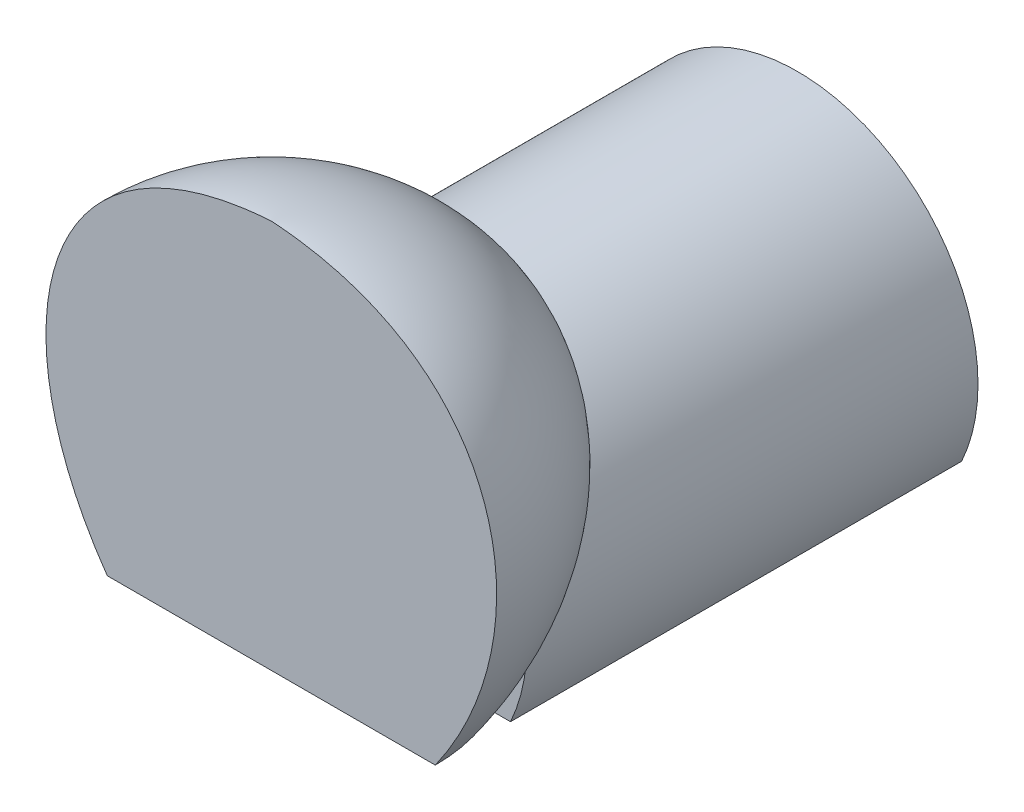
ISO-10303-21;
HEADER;
FILE_DESCRIPTION(('STEP AP214'),'2;1');
FILE_NAME('part.step','',(''),(''),'','','');
FILE_SCHEMA(('AUTOMOTIVE_DESIGN { 1 0 10303 214 1 1 1 1 }'));
ENDSEC;
DATA;
#1=APPLICATION_CONTEXT('core data for automotive mechanical design processes');
#2=APPLICATION_PROTOCOL_DEFINITION('international standard','automotive_design',2000,#1);
#3=PRODUCT_CONTEXT('',#1,'mechanical');
#4=PRODUCT('Part','Part','',(#3));
#5=PRODUCT_RELATED_PRODUCT_CATEGORY('part','',(#4));
#6=PRODUCT_DEFINITION_FORMATION('','',#4);
#7=PRODUCT_DEFINITION_CONTEXT('part definition',#1,'design');
#8=PRODUCT_DEFINITION('design','',#6,#7);
#9=PRODUCT_DEFINITION_SHAPE('','',#8);
#10=(LENGTH_UNIT() NAMED_UNIT(*) SI_UNIT(.MILLI.,.METRE.));
#11=(NAMED_UNIT(*) PLANE_ANGLE_UNIT() SI_UNIT($,.RADIAN.));
#12=(NAMED_UNIT(*) SI_UNIT($,.STERADIAN.) SOLID_ANGLE_UNIT());
#13=UNCERTAINTY_MEASURE_WITH_UNIT(LENGTH_MEASURE(1.E-05),#10,'distance_accuracy_value','');
#14=(GEOMETRIC_REPRESENTATION_CONTEXT(3) GLOBAL_UNCERTAINTY_ASSIGNED_CONTEXT((#13)) GLOBAL_UNIT_ASSIGNED_CONTEXT((#10,
#11,#12)) REPRESENTATION_CONTEXT('',''));
#15=CARTESIAN_POINT('',(0.,0.,0.));
#16=DIRECTION('',(0.,0.,1.));
#17=DIRECTION('',(1.,0.,0.));
#18=AXIS2_PLACEMENT_3D('',#15,#16,#17);
#19=CARTESIAN_POINT('',(10.9087121146357,0.,35.));
#20=DIRECTION('',(0.,-1.,0.));
#21=DIRECTION('',(0.,0.,-1.));
#22=AXIS2_PLACEMENT_3D('',#19,#20,#21);
#23=PLANE('',#22);
#24=CARTESIAN_POINT('',(10.9087121146357,0.,35.));
#25=DIRECTION('',(0.,-1.,0.));
#26=DIRECTION('',(0.,0.,-1.));
#27=AXIS2_PLACEMENT_3D('',#24,#25,#26);
#28=CIRCLE('',#27,10.9087121146357);
#29=CARTESIAN_POINT('',(0.,0.,35.0000000000001));
#30=VERTEX_POINT('',#29);
#31=CARTESIAN_POINT('',(21.8174242292714,0.,35.));
#32=VERTEX_POINT('',#31);
#33=EDGE_CURVE('E12',#30,#32,#28,.T.);
#34=ORIENTED_EDGE('',*,*,#33,.T.);
#35=DIRECTION('',(-1.,0.,0.));
#36=VECTOR('',#35,1.);
#37=CARTESIAN_POINT('',(10.9087121146357,0.,35.));
#38=LINE('',#37,#36);
#39=EDGE_CURVE('E65',#32,#30,#38,.T.);
#40=ORIENTED_EDGE('',*,*,#39,.T.);
#41=EDGE_LOOP('',(#34,#40));
#42=FACE_BOUND('',#41,.T.);
#43=ADVANCED_FACE('F43',(#42),#23,.T.);
#44=CARTESIAN_POINT('',(0.,0.,35.0000000000001));
#45=CARTESIAN_POINT('',(-7.69935288561253,10.9150571942187,35.0000000000001));
#46=CARTESIAN_POINT('',(-4.72379979597356,24.8623555992467,35.0000000000001));
#47=CARTESIAN_POINT('',(10.9087121146357,25.8843814165601,35.));
#48=B_SPLINE_CURVE_WITH_KNOTS('',3,(#44,#45,#46,#47),.UNSPECIFIED.,.F.,.F.,(4,4),(0.,1.),.UNSPECIFIED.);
#49=CARTESIAN_POINT('',(10.9087121146357,0.,35.));
#50=DIRECTION('',(0.,-1.,0.));
#51=AXIS1_PLACEMENT('',#49,#50);
#52=SURFACE_OF_REVOLUTION('',#48,#51);
#53=CARTESIAN_POINT('',(21.8174242292714,0.,35.));
#54=CARTESIAN_POINT('',(29.516777114884,10.9150571942187,35.));
#55=CARTESIAN_POINT('',(26.541224025245,24.8623555992467,35.));
#56=CARTESIAN_POINT('',(10.9087121146357,25.8843814165601,35.));
#57=B_SPLINE_CURVE_WITH_KNOTS('',3,(#53,#54,#55,#56),.UNSPECIFIED.,.F.,.F.,(4,4),(0.,1.),.UNSPECIFIED.);
#58=CARTESIAN_POINT('',(10.9087121146357,25.8843814165601,35.));
#59=VERTEX_POINT('',#58);
#60=EDGE_CURVE('E58',#32,#59,#57,.T.);
#61=ORIENTED_EDGE('',*,*,#60,.F.);
#62=ORIENTED_EDGE('',*,*,#33,.F.);
#63=EDGE_CURVE('E51',#30,#59,#48,.T.);
#64=ORIENTED_EDGE('',*,*,#63,.T.);
#65=EDGE_LOOP('',(#61,#62,#64));
#66=FACE_BOUND('',#65,.T.);
#67=ADVANCED_FACE('F45',(#66),#52,.F.);
#68=CARTESIAN_POINT('',(-3.29509324126532,16.6520774746195,35.0000000000001));
#69=DIRECTION('',(0.,0.,-1.));
#70=DIRECTION('',(-1.,0.,0.));
#71=AXIS2_PLACEMENT_3D('',#68,#69,#70);
#72=PLANE('',#71);
#73=ORIENTED_EDGE('',*,*,#39,.F.);
#74=ORIENTED_EDGE('',*,*,#60,.T.);
#75=ORIENTED_EDGE('',*,*,#63,.F.);
#76=EDGE_LOOP('',(#73,#74,#75));
#77=FACE_BOUND('',#76,.T.);
#78=ADVANCED_FACE('F66',(#77),#72,.F.);
#79=CLOSED_SHELL('',(#43,#67,#78));
#80=MANIFOLD_SOLID_BREP('B2',#79);
#81=CARTESIAN_POINT('',(10.9087121146357,5.,30.));
#82=DIRECTION('',(0.,0.,-1.));
#83=DIRECTION('',(-1.,0.,0.));
#84=AXIS2_PLACEMENT_3D('',#81,#82,#83);
#85=CYLINDRICAL_SURFACE('',#84,12.);
#86=CARTESIAN_POINT('',(10.9087121146357,5.,0.));
#87=DIRECTION('',(0.,0.,1.));
#88=DIRECTION('',(-1.,0.,0.));
#89=AXIS2_PLACEMENT_3D('',#86,#87,#88);
#90=CIRCLE('',#89,12.);
#91=CARTESIAN_POINT('',(21.8174242292714,0.,0.));
#92=VERTEX_POINT('',#91);
#93=CARTESIAN_POINT('',(0.,0.,0.));
#94=VERTEX_POINT('',#93);
#95=EDGE_CURVE('E140',#92,#94,#90,.T.);
#96=ORIENTED_EDGE('',*,*,#95,.T.);
#97=DIRECTION('',(0.,0.,-1.));
#98=VECTOR('',#97,1.);
#99=CARTESIAN_POINT('',(0.,0.,30.));
#100=LINE('',#99,#98);
#101=CARTESIAN_POINT('',(0.,0.,30.));
#102=VERTEX_POINT('',#101);
#103=EDGE_CURVE('E41',#102,#94,#100,.T.);
#104=ORIENTED_EDGE('',*,*,#103,.F.);
#105=CARTESIAN_POINT('',(10.9087121146357,5.,30.));
#106=DIRECTION('',(0.,0.,1.));
#107=DIRECTION('',(-1.,0.,0.));
#108=AXIS2_PLACEMENT_3D('',#105,#106,#107);
#109=CIRCLE('',#108,12.);
#110=CARTESIAN_POINT('',(21.8174242292714,0.,30.));
#111=VERTEX_POINT('',#110);
#112=EDGE_CURVE('E139',#111,#102,#109,.T.);
#113=ORIENTED_EDGE('',*,*,#112,.F.);
#114=DIRECTION('',(0.,0.,-1.));
#115=VECTOR('',#114,1.);
#116=CARTESIAN_POINT('',(21.8174242292714,0.,30.));
#117=LINE('',#116,#115);
#118=EDGE_CURVE('E117',#111,#92,#117,.T.);
#119=ORIENTED_EDGE('',*,*,#118,.T.);
#120=EDGE_LOOP('',(#96,#104,#113,#119));
#121=FACE_BOUND('',#120,.T.);
#122=ADVANCED_FACE('F109',(#121),#85,.T.);
#123=CARTESIAN_POINT('',(0.,0.,30.));
#124=DIRECTION('',(0.,1.,0.));
#125=DIRECTION('',(0.,0.,1.));
#126=AXIS2_PLACEMENT_3D('',#123,#124,#125);
#127=PLANE('',#126);
#128=DIRECTION('',(1.,0.,0.));
#129=VECTOR('',#128,1.);
#130=CARTESIAN_POINT('',(0.,0.,0.));
#131=LINE('',#130,#129);
#132=EDGE_CURVE('E132',#94,#92,#131,.T.);
#133=ORIENTED_EDGE('',*,*,#132,.T.);
#134=ORIENTED_EDGE('',*,*,#118,.F.);
#135=DIRECTION('',(1.,0.,0.));
#136=VECTOR('',#135,1.);
#137=CARTESIAN_POINT('',(0.,0.,30.));
#138=LINE('',#137,#136);
#139=EDGE_CURVE('E124',#102,#111,#138,.T.);
#140=ORIENTED_EDGE('',*,*,#139,.F.);
#141=ORIENTED_EDGE('',*,*,#103,.T.);
#142=EDGE_LOOP('',(#133,#134,#140,#141));
#143=FACE_BOUND('',#142,.T.);
#144=ADVANCED_FACE('F135',(#143),#127,.F.);
#145=CARTESIAN_POINT('',(10.9087121146357,5.,30.));
#146=DIRECTION('',(0.,0.,-1.));
#147=DIRECTION('',(-1.,0.,0.));
#148=AXIS2_PLACEMENT_3D('',#145,#146,#147);
#149=PLANE('',#148);
#150=ORIENTED_EDGE('',*,*,#112,.T.);
#151=ORIENTED_EDGE('',*,*,#139,.T.);
#152=EDGE_LOOP('',(#150,#151));
#153=FACE_BOUND('',#152,.T.);
#154=ADVANCED_FACE('F147',(#153),#149,.F.);
#155=CARTESIAN_POINT('',(10.9087121146357,5.,0.));
#156=DIRECTION('',(0.,0.,-1.));
#157=DIRECTION('',(-1.,0.,0.));
#158=AXIS2_PLACEMENT_3D('',#155,#156,#157);
#159=PLANE('',#158);
#160=ORIENTED_EDGE('',*,*,#95,.F.);
#161=ORIENTED_EDGE('',*,*,#132,.F.);
#162=EDGE_LOOP('',(#160,#161));
#163=FACE_BOUND('',#162,.T.);
#164=ADVANCED_FACE('F143',(#163),#159,.T.);
#165=CLOSED_SHELL('',(#122,#144,#154,#164));
#166=MANIFOLD_SOLID_BREP('B6',#165);
#167=ADVANCED_BREP_SHAPE_REPRESENTATION('',(#18,#80,#166),#14);
#168=SHAPE_DEFINITION_REPRESENTATION(#9,#167);
ENDSEC;
END-ISO-10303-21;
